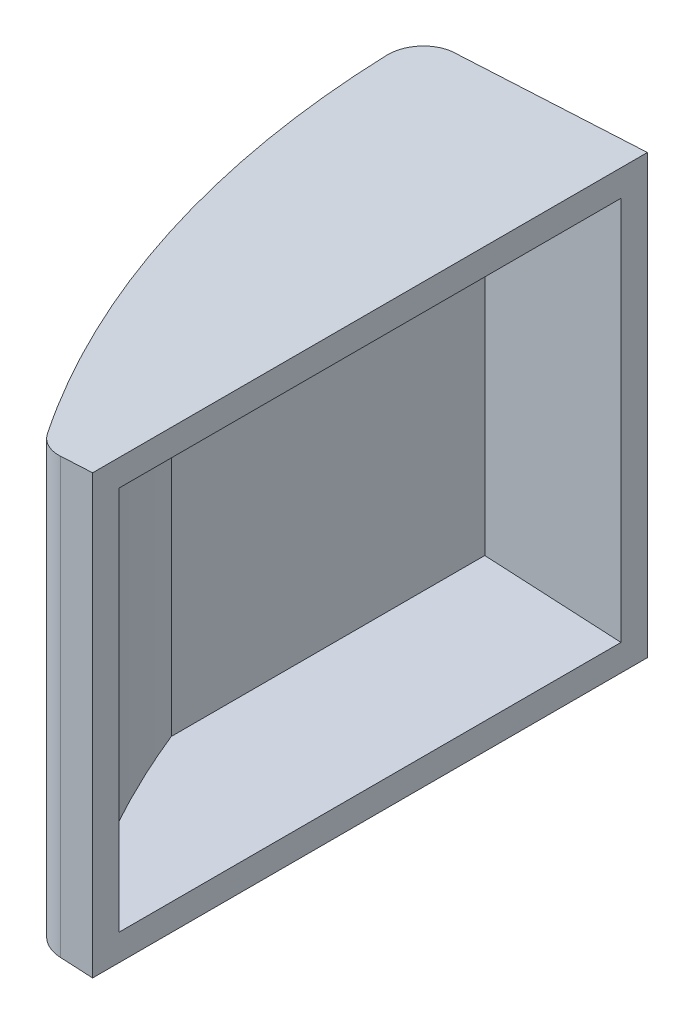
ISO-10303-21;
HEADER;
FILE_DESCRIPTION(('STEP AP214'),'2;1');
FILE_NAME('part.step','',(''),(''),'','','');
FILE_SCHEMA(('AUTOMOTIVE_DESIGN { 1 0 10303 214 1 1 1 1 }'));
ENDSEC;
DATA;
#1=APPLICATION_CONTEXT('core data for automotive mechanical design processes');
#2=APPLICATION_PROTOCOL_DEFINITION('international standard','automotive_design',2000,#1);
#3=PRODUCT_CONTEXT('',#1,'mechanical');
#4=PRODUCT('Part','Part','',(#3));
#5=PRODUCT_RELATED_PRODUCT_CATEGORY('part','',(#4));
#6=PRODUCT_DEFINITION_FORMATION('','',#4);
#7=PRODUCT_DEFINITION_CONTEXT('part definition',#1,'design');
#8=PRODUCT_DEFINITION('design','',#6,#7);
#9=PRODUCT_DEFINITION_SHAPE('','',#8);
#10=(LENGTH_UNIT() NAMED_UNIT(*) SI_UNIT(.MILLI.,.METRE.));
#11=(NAMED_UNIT(*) PLANE_ANGLE_UNIT() SI_UNIT($,.RADIAN.));
#12=(NAMED_UNIT(*) SI_UNIT($,.STERADIAN.) SOLID_ANGLE_UNIT());
#13=UNCERTAINTY_MEASURE_WITH_UNIT(LENGTH_MEASURE(1.E-05),#10,'distance_accuracy_value','');
#14=(GEOMETRIC_REPRESENTATION_CONTEXT(3) GLOBAL_UNCERTAINTY_ASSIGNED_CONTEXT((#13)) GLOBAL_UNIT_ASSIGNED_CONTEXT((#10,
#11,#12)) REPRESENTATION_CONTEXT('',''));
#15=CARTESIAN_POINT('',(0.,0.,0.));
#16=DIRECTION('',(0.,0.,1.));
#17=DIRECTION('',(1.,0.,0.));
#18=AXIS2_PLACEMENT_3D('',#15,#16,#17);
#19=CARTESIAN_POINT('',(5.5,1.60219575359667,-32.));
#20=DIRECTION('',(-1.,0.,0.));
#21=DIRECTION('',(0.,0.,1.));
#22=AXIS2_PLACEMENT_3D('',#19,#20,#21);
#23=PLANE('',#22);
#24=DIRECTION('',(0.,1.,0.));
#25=VECTOR('',#24,1.);
#26=CARTESIAN_POINT('',(5.5,0.,-32.));
#27=LINE('',#26,#25);
#28=CARTESIAN_POINT('',(5.5,24.4654400673182,-32.));
#29=VERTEX_POINT('',#28);
#30=CARTESIAN_POINT('',(5.5,2.03455993268177,-32.));
#31=VERTEX_POINT('',#30);
#32=EDGE_CURVE('E143',#29,#31,#27,.F.);
#33=ORIENTED_EDGE('',*,*,#32,.F.);
#34=DIRECTION('',(0.,0.,1.));
#35=VECTOR('',#34,1.);
#36=CARTESIAN_POINT('',(5.5,24.4654400673182,0.));
#37=LINE('',#36,#35);
#38=CARTESIAN_POINT('',(5.49999999999999,24.4654400673182,-13.0133250366527));
#39=VERTEX_POINT('',#38);
#40=EDGE_CURVE('E140',#29,#39,#37,.T.);
#41=ORIENTED_EDGE('',*,*,#40,.T.);
#42=DIRECTION('',(0.,1.,0.));
#43=VECTOR('',#42,1.);
#44=CARTESIAN_POINT('',(5.49999999999998,0.,-13.0133250366527));
#45=LINE('',#44,#43);
#46=CARTESIAN_POINT('',(5.49999999999999,2.03455993268177,-13.0133250366527));
#47=VERTEX_POINT('',#46);
#48=EDGE_CURVE('E135',#39,#47,#45,.F.);
#49=ORIENTED_EDGE('',*,*,#48,.T.);
#50=DIRECTION('',(0.,0.,1.));
#51=VECTOR('',#50,1.);
#52=CARTESIAN_POINT('',(5.5,2.03455993268176,0.));
#53=LINE('',#52,#51);
#54=EDGE_CURVE('E147',#47,#31,#53,.F.);
#55=ORIENTED_EDGE('',*,*,#54,.T.);
#56=EDGE_LOOP('',(#33,#41,#49,#55));
#57=FACE_BOUND('',#56,.T.);
#58=ADVANCED_FACE('F17',(#57),#23,.F.);
#59=CARTESIAN_POINT('',(57.8847674418605,0.,-33.6));
#60=DIRECTION('',(0.,1.,0.));
#61=DIRECTION('',(0.,0.,1.));
#62=AXIS2_PLACEMENT_3D('',#59,#60,#61);
#63=CYLINDRICAL_SURFACE('',#62,56.2847674418605);
#64=CARTESIAN_POINT('',(57.8847674418605,27.2108093972047,-33.6));
#65=DIRECTION('',(-0.052335956242944,0.998629534754574,0.));
#66=DIRECTION('',(0.998629534754574,0.052335956242944,0.));
#67=AXIS2_PLACEMENT_3D('',#64,#65,#66);
#68=ELLIPSE('',#67,56.3620096172032,56.2847674418605);
#69=CARTESIAN_POINT('',(11.4620431399296,24.7778975082716,-1.77382029882932));
#70=VERTEX_POINT('',#69);
#71=EDGE_CURVE('E92',#39,#70,#68,.T.);
#72=ORIENTED_EDGE('',*,*,#71,.T.);
#73=DIRECTION('',(0.,1.,0.));
#74=VECTOR('',#73,1.);
#75=CARTESIAN_POINT('',(11.4620431399294,0.,-1.77382029882921));
#76=LINE('',#75,#74);
#77=CARTESIAN_POINT('',(11.4620431399294,1.72210249172837,-1.7738202988292));
#78=VERTEX_POINT('',#77);
#79=EDGE_CURVE('E103',#70,#78,#76,.F.);
#80=ORIENTED_EDGE('',*,*,#79,.T.);
#81=CARTESIAN_POINT('',(57.8847674418605,-0.710809397204709,-33.6));
#82=DIRECTION('',(-0.052335956242944,-0.998629534754574,0.));
#83=DIRECTION('',(-0.998629534754574,0.052335956242944,0.));
#84=AXIS2_PLACEMENT_3D('',#81,#82,#83);
#85=ELLIPSE('',#84,56.3620096172032,56.2847674418605);
#86=EDGE_CURVE('E102',#78,#47,#85,.T.);
#87=ORIENTED_EDGE('',*,*,#86,.T.);
#88=ORIENTED_EDGE('',*,*,#48,.F.);
#89=EDGE_LOOP('',(#72,#80,#87,#88));
#90=FACE_BOUND('',#89,.T.);
#91=ADVANCED_FACE('F356',(#90),#63,.F.);
#92=CARTESIAN_POINT('',(11.7919563751569,0.,-2.));
#93=DIRECTION('',(0.,1.,0.));
#94=DIRECTION('',(0.,0.,1.));
#95=AXIS2_PLACEMENT_3D('',#92,#93,#94);
#96=CYLINDRICAL_SURFACE('',#95,0.4);
#97=DIRECTION('',(0.,1.,0.));
#98=VECTOR('',#97,1.);
#99=CARTESIAN_POINT('',(11.7919563751569,0.,-1.6));
#100=LINE('',#99,#98);
#101=CARTESIAN_POINT('',(11.7919563751569,1.70481247171401,-1.6));
#102=VERTEX_POINT('',#101);
#103=CARTESIAN_POINT('',(11.7919563751569,24.795187528286,-1.6));
#104=VERTEX_POINT('',#103);
#105=EDGE_CURVE('E81',#102,#104,#100,.T.);
#106=ORIENTED_EDGE('',*,*,#105,.F.);
#107=CARTESIAN_POINT('',(11.7919563751569,1.70481247171401,-2.));
#108=DIRECTION('',(-0.052335956242944,-0.998629534754574,0.));
#109=DIRECTION('',(-0.998629534754574,0.052335956242944,0.));
#110=AXIS2_PLACEMENT_3D('',#107,#108,#109);
#111=ELLIPSE('',#110,0.400548938399169,0.4);
#112=EDGE_CURVE('E20',#102,#78,#111,.T.);
#113=ORIENTED_EDGE('',*,*,#112,.T.);
#114=ORIENTED_EDGE('',*,*,#79,.F.);
#115=CARTESIAN_POINT('',(11.7919563751569,24.795187528286,-2.));
#116=DIRECTION('',(-0.052335956242944,0.998629534754574,0.));
#117=DIRECTION('',(0.998629534754574,0.052335956242944,0.));
#118=AXIS2_PLACEMENT_3D('',#115,#116,#117);
#119=ELLIPSE('',#118,0.400548938399169,0.4);
#120=EDGE_CURVE('E86',#70,#104,#119,.T.);
#121=ORIENTED_EDGE('',*,*,#120,.T.);
#122=EDGE_LOOP('',(#106,#113,#114,#121));
#123=FACE_BOUND('',#122,.T.);
#124=ADVANCED_FACE('F83',(#123),#96,.F.);
#125=CARTESIAN_POINT('',(13.8337375299887,1.59780725560732,0.));
#126=DIRECTION('',(-0.052335956242944,-0.998629534754574,0.));
#127=DIRECTION('',(0.998629534754574,-0.052335956242944,0.));
#128=AXIS2_PLACEMENT_3D('',#125,#126,#127);
#129=PLANE('',#128);
#130=ORIENTED_EDGE('',*,*,#54,.F.);
#131=ORIENTED_EDGE('',*,*,#86,.F.);
#132=ORIENTED_EDGE('',*,*,#112,.F.);
#133=DIRECTION('',(-0.998629534754574,0.0523359562429439,0.));
#134=VECTOR('',#133,1.);
#135=CARTESIAN_POINT('',(13.75,1.60219575359667,-1.6));
#136=LINE('',#135,#134);
#137=CARTESIAN_POINT('',(13.75,1.60219575359667,-1.6));
#138=VERTEX_POINT('',#137);
#139=EDGE_CURVE('E99',#138,#102,#136,.T.);
#140=ORIENTED_EDGE('',*,*,#139,.F.);
#141=DIRECTION('',(0.,0.,1.));
#142=VECTOR('',#141,1.);
#143=CARTESIAN_POINT('',(13.75,1.60219575359668,0.));
#144=LINE('',#143,#142);
#145=CARTESIAN_POINT('',(13.75,1.60219575359667,-32.));
#146=VERTEX_POINT('',#145);
#147=EDGE_CURVE('E111',#138,#146,#144,.F.);
#148=ORIENTED_EDGE('',*,*,#147,.T.);
#149=DIRECTION('',(0.998629534754574,-0.052335956242944,0.));
#150=VECTOR('',#149,1.);
#151=CARTESIAN_POINT('',(5.5,2.03455993268177,-32.));
#152=LINE('',#151,#150);
#153=EDGE_CURVE('E146',#31,#146,#152,.T.);
#154=ORIENTED_EDGE('',*,*,#153,.F.);
#155=EDGE_LOOP('',(#130,#131,#132,#140,#148,#154));
#156=FACE_BOUND('',#155,.T.);
#157=ADVANCED_FACE('F97',(#156),#129,.F.);
#158=CARTESIAN_POINT('',(13.75,0.,-32.));
#159=DIRECTION('',(0.,0.,1.));
#160=DIRECTION('',(1.,0.,0.));
#161=AXIS2_PLACEMENT_3D('',#158,#159,#160);
#162=PLANE('',#161);
#163=ORIENTED_EDGE('',*,*,#153,.T.);
#164=DIRECTION('',(0.,1.,0.));
#165=VECTOR('',#164,1.);
#166=CARTESIAN_POINT('',(13.75,26.5,-32.));
#167=LINE('',#166,#165);
#168=CARTESIAN_POINT('',(13.75,24.8978042464033,-32.));
#169=VERTEX_POINT('',#168);
#170=EDGE_CURVE('E124',#146,#169,#167,.T.);
#171=ORIENTED_EDGE('',*,*,#170,.T.);
#172=DIRECTION('',(-0.998629534754574,-0.052335956242944,0.));
#173=VECTOR('',#172,1.);
#174=CARTESIAN_POINT('',(13.8337375299887,24.9021927443927,-32.));
#175=LINE('',#174,#173);
#176=EDGE_CURVE('E137',#169,#29,#175,.T.);
#177=ORIENTED_EDGE('',*,*,#176,.T.);
#178=ORIENTED_EDGE('',*,*,#32,.T.);
#179=EDGE_LOOP('',(#163,#171,#177,#178));
#180=FACE_BOUND('',#179,.T.);
#181=ADVANCED_FACE('F329',(#180),#162,.T.);
#182=CARTESIAN_POINT('',(13.8337375299887,24.9021927443927,0.));
#183=DIRECTION('',(-0.052335956242944,0.998629534754574,0.));
#184=DIRECTION('',(-0.998629534754574,-0.052335956242944,0.));
#185=AXIS2_PLACEMENT_3D('',#182,#183,#184);
#186=PLANE('',#185);
#187=ORIENTED_EDGE('',*,*,#40,.F.);
#188=ORIENTED_EDGE('',*,*,#176,.F.);
#189=DIRECTION('',(0.,0.,1.));
#190=VECTOR('',#189,1.);
#191=CARTESIAN_POINT('',(13.75,24.8978042464033,0.));
#192=LINE('',#191,#190);
#193=CARTESIAN_POINT('',(13.75,24.8978042464033,-1.6));
#194=VERTEX_POINT('',#193);
#195=EDGE_CURVE('E120',#169,#194,#192,.T.);
#196=ORIENTED_EDGE('',*,*,#195,.T.);
#197=DIRECTION('',(0.998629534754574,0.0523359562429433,0.));
#198=VECTOR('',#197,1.);
#199=CARTESIAN_POINT('',(11.7919563751569,24.795187528286,-1.6));
#200=LINE('',#199,#198);
#201=EDGE_CURVE('E91',#104,#194,#200,.T.);
#202=ORIENTED_EDGE('',*,*,#201,.F.);
#203=ORIENTED_EDGE('',*,*,#120,.F.);
#204=ORIENTED_EDGE('',*,*,#71,.F.);
#205=EDGE_LOOP('',(#187,#188,#196,#202,#203,#204));
#206=FACE_BOUND('',#205,.T.);
#207=ADVANCED_FACE('F320',(#206),#186,.F.);
#208=CARTESIAN_POINT('',(13.75,0.,-1.6));
#209=DIRECTION('',(0.,0.,-1.));
#210=DIRECTION('',(-1.,0.,0.));
#211=AXIS2_PLACEMENT_3D('',#208,#209,#210);
#212=PLANE('',#211);
#213=DIRECTION('',(0.,1.,0.));
#214=VECTOR('',#213,1.);
#215=CARTESIAN_POINT('',(13.75,26.5,-1.6));
#216=LINE('',#215,#214);
#217=EDGE_CURVE('E106',#194,#138,#216,.F.);
#218=ORIENTED_EDGE('',*,*,#217,.T.);
#219=ORIENTED_EDGE('',*,*,#139,.T.);
#220=ORIENTED_EDGE('',*,*,#105,.T.);
#221=ORIENTED_EDGE('',*,*,#201,.T.);
#222=EDGE_LOOP('',(#218,#219,#220,#221));
#223=FACE_BOUND('',#222,.T.);
#224=ADVANCED_FACE('F104',(#223),#212,.T.);
#225=CARTESIAN_POINT('',(13.75,0.,-33.6));
#226=DIRECTION('',(0.,0.,1.));
#227=DIRECTION('',(1.,0.,0.));
#228=AXIS2_PLACEMENT_3D('',#225,#226,#227);
#229=PLANE('',#228);
#230=DIRECTION('',(0.,1.,0.));
#231=VECTOR('',#230,1.);
#232=CARTESIAN_POINT('',(2.03579939382195,0.,-33.6));
#233=LINE('',#232,#231);
#234=CARTESIAN_POINT('',(2.03579939382195,25.8860847601542,-33.6));
#235=VERTEX_POINT('',#234);
#236=CARTESIAN_POINT('',(2.03579939382195,0.613915239845848,-33.6));
#237=VERTEX_POINT('',#236);
#238=EDGE_CURVE('E174',#235,#237,#233,.F.);
#239=ORIENTED_EDGE('',*,*,#238,.F.);
#240=DIRECTION('',(-0.998629534754574,-0.052335956242944,0.));
#241=VECTOR('',#240,1.);
#242=CARTESIAN_POINT('',(13.75,26.5,-33.6));
#243=LINE('',#242,#241);
#244=CARTESIAN_POINT('',(13.75,26.5,-33.6));
#245=VERTEX_POINT('',#244);
#246=EDGE_CURVE('E178',#245,#235,#243,.T.);
#247=ORIENTED_EDGE('',*,*,#246,.F.);
#248=DIRECTION('',(0.,1.,0.));
#249=VECTOR('',#248,1.);
#250=CARTESIAN_POINT('',(13.75,26.5,-33.6));
#251=LINE('',#250,#249);
#252=CARTESIAN_POINT('',(13.75,0.,-33.6));
#253=VERTEX_POINT('',#252);
#254=EDGE_CURVE('E108',#245,#253,#251,.F.);
#255=ORIENTED_EDGE('',*,*,#254,.T.);
#256=DIRECTION('',(0.998629534754574,-0.052335956242944,0.));
#257=VECTOR('',#256,1.);
#258=CARTESIAN_POINT('',(13.75,0.,-33.6));
#259=LINE('',#258,#257);
#260=EDGE_CURVE('E173',#237,#253,#259,.T.);
#261=ORIENTED_EDGE('',*,*,#260,.F.);
#262=EDGE_LOOP('',(#239,#247,#255,#261));
#263=FACE_BOUND('',#262,.T.);
#264=ADVANCED_FACE('F301',(#263),#229,.F.);
#265=CARTESIAN_POINT('',(13.75,26.5,0.));
#266=DIRECTION('',(-1.,0.,0.));
#267=DIRECTION('',(0.,0.,1.));
#268=AXIS2_PLACEMENT_3D('',#265,#266,#267);
#269=PLANE('',#268);
#270=ORIENTED_EDGE('',*,*,#195,.F.);
#271=ORIENTED_EDGE('',*,*,#170,.F.);
#272=ORIENTED_EDGE('',*,*,#147,.F.);
#273=ORIENTED_EDGE('',*,*,#217,.F.);
#274=EDGE_LOOP('',(#270,#271,#272,#273));
#275=FACE_BOUND('',#274,.T.);
#276=DIRECTION('',(0.,0.,1.));
#277=VECTOR('',#276,1.);
#278=CARTESIAN_POINT('',(13.75,0.,0.));
#279=LINE('',#278,#277);
#280=CARTESIAN_POINT('',(13.75,0.,0.));
#281=VERTEX_POINT('',#280);
#282=EDGE_CURVE('E203',#253,#281,#279,.T.);
#283=ORIENTED_EDGE('',*,*,#282,.F.);
#284=ORIENTED_EDGE('',*,*,#254,.F.);
#285=DIRECTION('',(0.,0.,1.));
#286=VECTOR('',#285,1.);
#287=CARTESIAN_POINT('',(13.75,26.5,0.));
#288=LINE('',#287,#286);
#289=CARTESIAN_POINT('',(13.75,26.5,0.));
#290=VERTEX_POINT('',#289);
#291=EDGE_CURVE('E195',#290,#245,#288,.F.);
#292=ORIENTED_EDGE('',*,*,#291,.F.);
#293=DIRECTION('',(0.,1.,0.));
#294=VECTOR('',#293,1.);
#295=CARTESIAN_POINT('',(13.75,0.,0.));
#296=LINE('',#295,#294);
#297=EDGE_CURVE('E119',#290,#281,#296,.F.);
#298=ORIENTED_EDGE('',*,*,#297,.T.);
#299=EDGE_LOOP('',(#283,#284,#292,#298));
#300=FACE_BOUND('',#299,.T.);
#301=ADVANCED_FACE('F291',(#275,#300),#269,.F.);
#302=CARTESIAN_POINT('',(13.75,0.,0.));
#303=DIRECTION('',(0.,0.,-1.));
#304=DIRECTION('',(-1.,0.,0.));
#305=AXIS2_PLACEMENT_3D('',#302,#303,#304);
#306=PLANE('',#305);
#307=DIRECTION('',(0.998629534754574,-0.052335956242944,0.));
#308=VECTOR('',#307,1.);
#309=CARTESIAN_POINT('',(13.75,0.,0.));
#310=LINE('',#309,#308);
#311=CARTESIAN_POINT('',(11.7919563751569,0.102616718117341,0.));
#312=VERTEX_POINT('',#311);
#313=EDGE_CURVE('E169',#281,#312,#310,.F.);
#314=ORIENTED_EDGE('',*,*,#313,.F.);
#315=ORIENTED_EDGE('',*,*,#297,.F.);
#316=DIRECTION('',(-0.998629534754574,-0.052335956242944,0.));
#317=VECTOR('',#316,1.);
#318=CARTESIAN_POINT('',(13.75,26.5,0.));
#319=LINE('',#318,#317);
#320=CARTESIAN_POINT('',(11.7919563751569,26.3973832818827,0.));
#321=VERTEX_POINT('',#320);
#322=EDGE_CURVE('E198',#321,#290,#319,.F.);
#323=ORIENTED_EDGE('',*,*,#322,.F.);
#324=DIRECTION('',(0.,1.,0.));
#325=VECTOR('',#324,1.);
#326=CARTESIAN_POINT('',(11.7919563751569,0.,0.));
#327=LINE('',#326,#325);
#328=EDGE_CURVE('E164',#312,#321,#327,.T.);
#329=ORIENTED_EDGE('',*,*,#328,.F.);
#330=EDGE_LOOP('',(#314,#315,#323,#329));
#331=FACE_BOUND('',#330,.T.);
#332=ADVANCED_FACE('F281',(#331),#306,.F.);
#333=CARTESIAN_POINT('',(13.75,26.5,0.));
#334=DIRECTION('',(-0.052335956242944,0.998629534754574,0.));
#335=DIRECTION('',(-0.998629534754574,-0.052335956242944,0.));
#336=AXIS2_PLACEMENT_3D('',#333,#334,#335);
#337=PLANE('',#336);
#338=CARTESIAN_POINT('',(2.03579939382195,25.8860847601542,-31.6));
#339=DIRECTION('',(-0.052335956242944,0.998629534754574,0.));
#340=DIRECTION('',(0.998629534754574,0.052335956242944,0.));
#341=AXIS2_PLACEMENT_3D('',#338,#339,#340);
#342=ELLIPSE('',#341,2.00274469199584,2.);
#343=CARTESIAN_POINT('',(0.0370805799290333,25.7813363457068,-31.5284241451991));
#344=VERTEX_POINT('',#343);
#345=EDGE_CURVE('E175',#344,#235,#342,.F.);
#346=ORIENTED_EDGE('',*,*,#345,.F.);
#347=CARTESIAN_POINT('',(57.8847674418605,28.8130051508014,-33.6));
#348=DIRECTION('',(-0.052335956242944,0.998629534754574,0.));
#349=DIRECTION('',(0.998629534754574,0.052335956242944,0.));
#350=AXIS2_PLACEMENT_3D('',#347,#348,#349);
#351=ELLIPSE('',#350,57.9642053707999,57.8847674418605);
#352=CARTESIAN_POINT('',(10.1423901990193,26.3109331818109,-0.869101494145926));
#353=VERTEX_POINT('',#352);
#354=EDGE_CURVE('E161',#353,#344,#351,.F.);
#355=ORIENTED_EDGE('',*,*,#354,.F.);
#356=CARTESIAN_POINT('',(11.7919563751569,26.3973832818827,-2.));
#357=DIRECTION('',(-0.052335956242944,0.998629534754574,0.));
#358=DIRECTION('',(0.998629534754574,0.052335956242944,0.));
#359=AXIS2_PLACEMENT_3D('',#356,#357,#358);
#360=ELLIPSE('',#359,2.00274469199584,2.);
#361=EDGE_CURVE('E166',#321,#353,#360,.F.);
#362=ORIENTED_EDGE('',*,*,#361,.F.);
#363=ORIENTED_EDGE('',*,*,#322,.T.);
#364=ORIENTED_EDGE('',*,*,#291,.T.);
#365=ORIENTED_EDGE('',*,*,#246,.T.);
#366=EDGE_LOOP('',(#346,#355,#362,#363,#364,#365));
#367=FACE_BOUND('',#366,.T.);
#368=ADVANCED_FACE('F247',(#367),#337,.T.);
#369=CARTESIAN_POINT('',(2.03579939382195,0.,-31.6));
#370=DIRECTION('',(0.,1.,0.));
#371=DIRECTION('',(0.,0.,1.));
#372=AXIS2_PLACEMENT_3D('',#369,#370,#371);
#373=CYLINDRICAL_SURFACE('',#372,2.);
#374=CARTESIAN_POINT('',(2.03579939382195,0.613915239845848,-31.6));
#375=DIRECTION('',(-0.052335956242944,-0.998629534754574,0.));
#376=DIRECTION('',(-0.998629534754574,0.052335956242944,0.));
#377=AXIS2_PLACEMENT_3D('',#374,#375,#376);
#378=ELLIPSE('',#377,2.00274469199584,2.);
#379=CARTESIAN_POINT('',(0.0370805799290333,0.71866365429321,-31.5284241451991));
#380=VERTEX_POINT('',#379);
#381=EDGE_CURVE('E170',#380,#237,#378,.T.);
#382=ORIENTED_EDGE('',*,*,#381,.F.);
#383=DIRECTION('',(0.,1.,0.));
#384=VECTOR('',#383,1.);
#385=CARTESIAN_POINT('',(0.0370805799290302,0.,-31.5284241451991));
#386=LINE('',#385,#384);
#387=EDGE_CURVE('E160',#344,#380,#386,.F.);
#388=ORIENTED_EDGE('',*,*,#387,.F.);
#389=ORIENTED_EDGE('',*,*,#345,.T.);
#390=ORIENTED_EDGE('',*,*,#238,.T.);
#391=EDGE_LOOP('',(#382,#388,#389,#390));
#392=FACE_BOUND('',#391,.T.);
#393=ADVANCED_FACE('F232',(#392),#373,.T.);
#394=CARTESIAN_POINT('',(13.75,0.,0.));
#395=DIRECTION('',(-0.052335956242944,-0.998629534754574,0.));
#396=DIRECTION('',(0.998629534754574,-0.052335956242944,0.));
#397=AXIS2_PLACEMENT_3D('',#394,#395,#396);
#398=PLANE('',#397);
#399=ORIENTED_EDGE('',*,*,#282,.T.);
#400=ORIENTED_EDGE('',*,*,#313,.T.);
#401=CARTESIAN_POINT('',(11.7919563751569,0.102616718117341,-2.));
#402=DIRECTION('',(-0.052335956242944,-0.998629534754574,0.));
#403=DIRECTION('',(-0.998629534754574,0.052335956242944,0.));
#404=AXIS2_PLACEMENT_3D('',#401,#402,#403);
#405=ELLIPSE('',#404,2.00274469199584,2.);
#406=CARTESIAN_POINT('',(10.1423901990194,0.18906681818913,-0.86910149414598));
#407=VERTEX_POINT('',#406);
#408=EDGE_CURVE('E35',#407,#312,#405,.F.);
#409=ORIENTED_EDGE('',*,*,#408,.F.);
#410=CARTESIAN_POINT('',(57.8847674418605,-2.31300515080138,-33.6));
#411=DIRECTION('',(-0.052335956242944,-0.998629534754574,0.));
#412=DIRECTION('',(-0.998629534754574,0.052335956242944,0.));
#413=AXIS2_PLACEMENT_3D('',#410,#411,#412);
#414=ELLIPSE('',#413,57.9642053707999,57.8847674418605);
#415=EDGE_CURVE('E26',#380,#407,#414,.F.);
#416=ORIENTED_EDGE('',*,*,#415,.F.);
#417=ORIENTED_EDGE('',*,*,#381,.T.);
#418=ORIENTED_EDGE('',*,*,#260,.T.);
#419=EDGE_LOOP('',(#399,#400,#409,#416,#417,#418));
#420=FACE_BOUND('',#419,.T.);
#421=ADVANCED_FACE('F235',(#420),#398,.T.);
#422=CARTESIAN_POINT('',(11.7919563751569,0.,-2.));
#423=DIRECTION('',(0.,1.,0.));
#424=DIRECTION('',(0.,0.,1.));
#425=AXIS2_PLACEMENT_3D('',#422,#423,#424);
#426=CYLINDRICAL_SURFACE('',#425,2.);
#427=ORIENTED_EDGE('',*,*,#408,.T.);
#428=ORIENTED_EDGE('',*,*,#328,.T.);
#429=ORIENTED_EDGE('',*,*,#361,.T.);
#430=DIRECTION('',(0.,1.,0.));
#431=VECTOR('',#430,1.);
#432=CARTESIAN_POINT('',(10.1423901990194,0.,-0.869101494145992));
#433=LINE('',#432,#431);
#434=EDGE_CURVE('E11',#407,#353,#433,.T.);
#435=ORIENTED_EDGE('',*,*,#434,.F.);
#436=EDGE_LOOP('',(#427,#428,#429,#435));
#437=FACE_BOUND('',#436,.T.);
#438=ADVANCED_FACE('F238',(#437),#426,.T.);
#439=CARTESIAN_POINT('',(57.8847674418605,0.,-33.6));
#440=DIRECTION('',(0.,1.,0.));
#441=DIRECTION('',(0.,0.,1.));
#442=AXIS2_PLACEMENT_3D('',#439,#440,#441);
#443=CYLINDRICAL_SURFACE('',#442,57.8847674418605);
#444=ORIENTED_EDGE('',*,*,#415,.T.);
#445=ORIENTED_EDGE('',*,*,#434,.T.);
#446=ORIENTED_EDGE('',*,*,#354,.T.);
#447=ORIENTED_EDGE('',*,*,#387,.T.);
#448=EDGE_LOOP('',(#444,#445,#446,#447));
#449=FACE_BOUND('',#448,.T.);
#450=ADVANCED_FACE('F230',(#449),#443,.T.);
#451=CLOSED_SHELL('',(#58,#91,#124,#157,#181,#207,#224,#264,#301,#332,#368,#393,#421,#438,#450));
#452=MANIFOLD_SOLID_BREP('B1',#451);
#453=ADVANCED_BREP_SHAPE_REPRESENTATION('',(#18,#452),#14);
#454=SHAPE_DEFINITION_REPRESENTATION(#9,#453);
ENDSEC;
END-ISO-10303-21;
